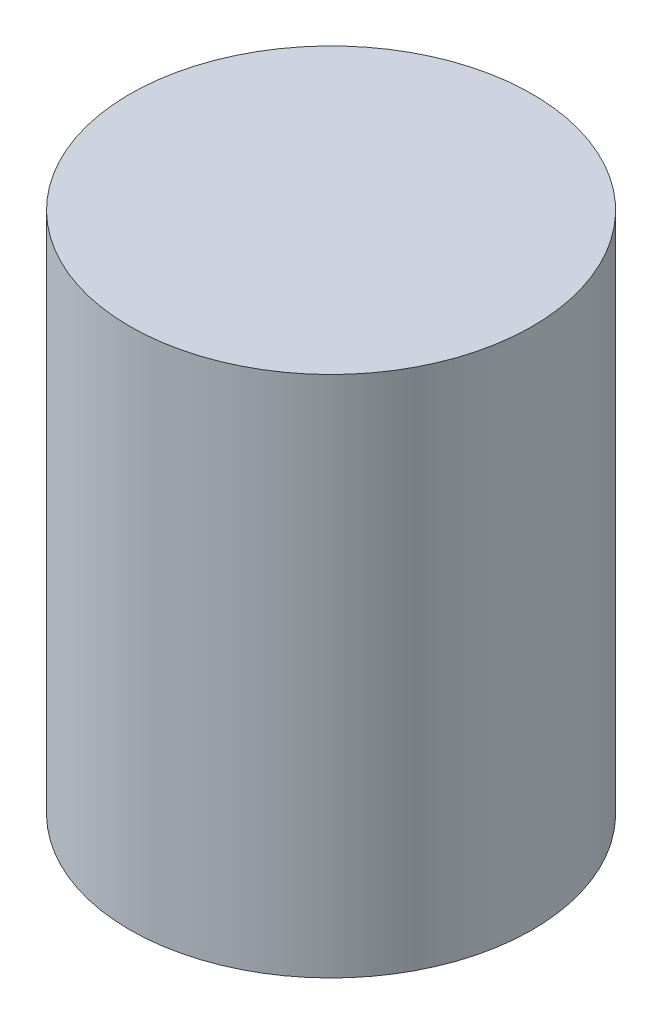
ISO-10303-21;
HEADER;
FILE_DESCRIPTION(('STEP AP214'),'2;1');
FILE_NAME('part.step','',(''),(''),'','','');
FILE_SCHEMA(('AUTOMOTIVE_DESIGN { 1 0 10303 214 1 1 1 1 }'));
ENDSEC;
DATA;
#1=APPLICATION_CONTEXT('core data for automotive mechanical design processes');
#2=APPLICATION_PROTOCOL_DEFINITION('international standard','automotive_design',2000,#1);
#3=PRODUCT_CONTEXT('',#1,'mechanical');
#4=PRODUCT('Part','Part','',(#3));
#5=PRODUCT_RELATED_PRODUCT_CATEGORY('part','',(#4));
#6=PRODUCT_DEFINITION_FORMATION('','',#4);
#7=PRODUCT_DEFINITION_CONTEXT('part definition',#1,'design');
#8=PRODUCT_DEFINITION('design','',#6,#7);
#9=PRODUCT_DEFINITION_SHAPE('','',#8);
#10=(LENGTH_UNIT() NAMED_UNIT(*) SI_UNIT(.MILLI.,.METRE.));
#11=(NAMED_UNIT(*) PLANE_ANGLE_UNIT() SI_UNIT($,.RADIAN.));
#12=(NAMED_UNIT(*) SI_UNIT($,.STERADIAN.) SOLID_ANGLE_UNIT());
#13=UNCERTAINTY_MEASURE_WITH_UNIT(LENGTH_MEASURE(1.E-05),#10,'distance_accuracy_value','');
#14=(GEOMETRIC_REPRESENTATION_CONTEXT(3) GLOBAL_UNCERTAINTY_ASSIGNED_CONTEXT((#13)) GLOBAL_UNIT_ASSIGNED_CONTEXT((#10,
#11,#12)) REPRESENTATION_CONTEXT('',''));
#15=CARTESIAN_POINT('',(0.,0.,0.));
#16=DIRECTION('',(0.,0.,1.));
#17=DIRECTION('',(1.,0.,0.));
#18=AXIS2_PLACEMENT_3D('',#15,#16,#17);
#19=CARTESIAN_POINT('',(0.,50.,0.));
#20=DIRECTION('',(0.,-1.,0.));
#21=DIRECTION('',(0.,0.,-1.));
#22=AXIS2_PLACEMENT_3D('',#19,#20,#21);
#23=CYLINDRICAL_SURFACE('',#22,19.25);
#24=CARTESIAN_POINT('',(0.,50.,0.));
#25=DIRECTION('',(0.,1.,0.));
#26=DIRECTION('',(0.,0.,1.));
#27=AXIS2_PLACEMENT_3D('',#24,#25,#26);
#28=CIRCLE('',#27,19.25);
#29=CARTESIAN_POINT('',(0.,50.,19.25));
#30=VERTEX_POINT('',#29);
#31=EDGE_CURVE('E10',#30,#30,#28,.T.);
#32=ORIENTED_EDGE('',*,*,#31,.F.);
#33=EDGE_LOOP('',(#32));
#34=FACE_BOUND('',#33,.T.);
#35=CARTESIAN_POINT('',(0.,0.,0.));
#36=DIRECTION('',(0.,1.,0.));
#37=DIRECTION('',(0.,0.,1.));
#38=AXIS2_PLACEMENT_3D('',#35,#36,#37);
#39=CIRCLE('',#38,19.25);
#40=CARTESIAN_POINT('',(0.,0.,19.25));
#41=VERTEX_POINT('',#40);
#42=EDGE_CURVE('E31',#41,#41,#39,.T.);
#43=ORIENTED_EDGE('',*,*,#42,.T.);
#44=EDGE_LOOP('',(#43));
#45=FACE_BOUND('',#44,.T.);
#46=ADVANCED_FACE('F28',(#34,#45),#23,.T.);
#47=CARTESIAN_POINT('',(0.,50.,0.));
#48=DIRECTION('',(0.,1.,0.));
#49=DIRECTION('',(0.,0.,1.));
#50=AXIS2_PLACEMENT_3D('',#47,#48,#49);
#51=PLANE('',#50);
#52=ORIENTED_EDGE('',*,*,#31,.T.);
#53=EDGE_LOOP('',(#52));
#54=FACE_BOUND('',#53,.T.);
#55=ADVANCED_FACE('F43',(#54),#51,.T.);
#56=CARTESIAN_POINT('',(0.,0.,0.));
#57=DIRECTION('',(0.,1.,0.));
#58=DIRECTION('',(0.,0.,1.));
#59=AXIS2_PLACEMENT_3D('',#56,#57,#58);
#60=PLANE('',#59);
#61=ORIENTED_EDGE('',*,*,#42,.F.);
#62=EDGE_LOOP('',(#61));
#63=FACE_BOUND('',#62,.T.);
#64=ADVANCED_FACE('F41',(#63),#60,.F.);
#65=CLOSED_SHELL('',(#46,#55,#64));
#66=MANIFOLD_SOLID_BREP('B2',#65);
#67=ADVANCED_BREP_SHAPE_REPRESENTATION('',(#18,#66),#14);
#68=SHAPE_DEFINITION_REPRESENTATION(#9,#67);
ENDSEC;
END-ISO-10303-21;
